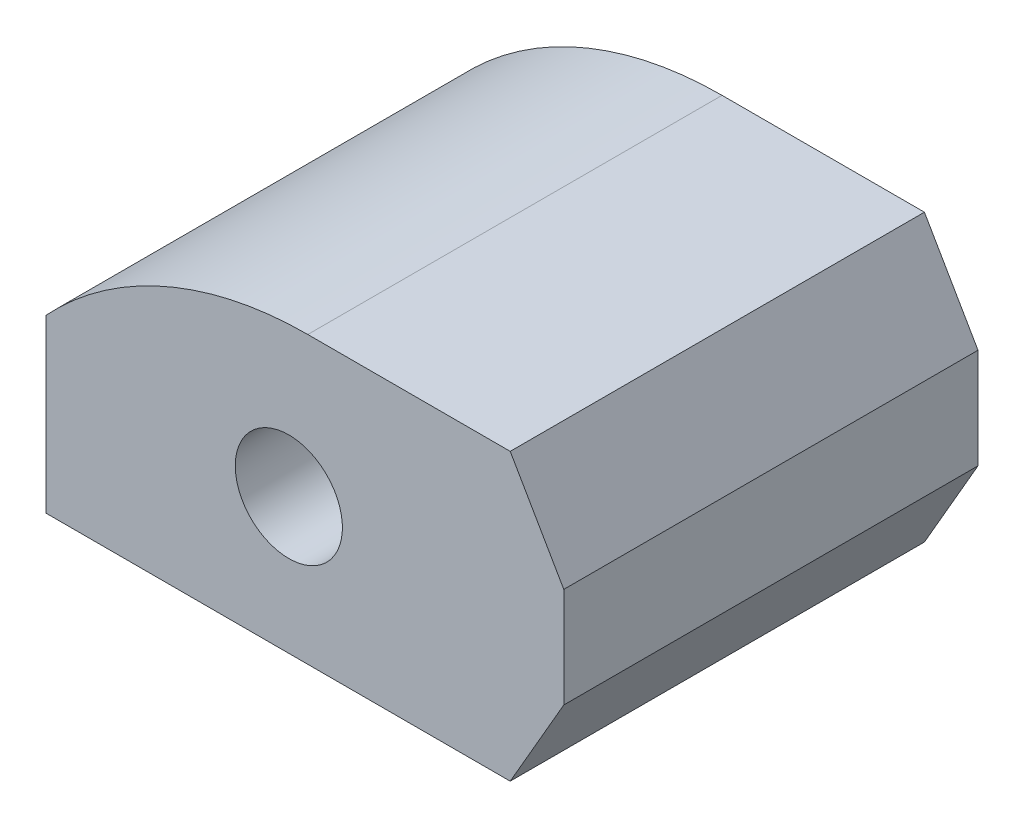
ISO-10303-21;
HEADER;
FILE_DESCRIPTION(('STEP AP214'),'2;1');
FILE_NAME('part.step','',(''),(''),'','','');
FILE_SCHEMA(('AUTOMOTIVE_DESIGN { 1 0 10303 214 1 1 1 1 }'));
ENDSEC;
DATA;
#1=APPLICATION_CONTEXT('core data for automotive mechanical design processes');
#2=APPLICATION_PROTOCOL_DEFINITION('international standard','automotive_design',2000,#1);
#3=PRODUCT_CONTEXT('',#1,'mechanical');
#4=PRODUCT('Part','Part','',(#3));
#5=PRODUCT_RELATED_PRODUCT_CATEGORY('part','',(#4));
#6=PRODUCT_DEFINITION_FORMATION('','',#4);
#7=PRODUCT_DEFINITION_CONTEXT('part definition',#1,'design');
#8=PRODUCT_DEFINITION('design','',#6,#7);
#9=PRODUCT_DEFINITION_SHAPE('','',#8);
#10=(LENGTH_UNIT() NAMED_UNIT(*) SI_UNIT(.MILLI.,.METRE.));
#11=(NAMED_UNIT(*) PLANE_ANGLE_UNIT() SI_UNIT($,.RADIAN.));
#12=(NAMED_UNIT(*) SI_UNIT($,.STERADIAN.) SOLID_ANGLE_UNIT());
#13=UNCERTAINTY_MEASURE_WITH_UNIT(LENGTH_MEASURE(1.E-05),#10,'distance_accuracy_value','');
#14=(GEOMETRIC_REPRESENTATION_CONTEXT(3) GLOBAL_UNCERTAINTY_ASSIGNED_CONTEXT((#13)) GLOBAL_UNIT_ASSIGNED_CONTEXT((#10,
#11,#12)) REPRESENTATION_CONTEXT('',''));
#15=CARTESIAN_POINT('',(0.,0.,0.));
#16=DIRECTION('',(0.,0.,1.));
#17=DIRECTION('',(1.,0.,0.));
#18=AXIS2_PLACEMENT_3D('',#15,#16,#17);
#19=CARTESIAN_POINT('',(2.66060555964671,-29.,58.));
#20=DIRECTION('',(0.,0.,-1.));
#21=DIRECTION('',(-1.,0.,0.));
#22=AXIS2_PLACEMENT_3D('',#19,#20,#21);
#23=PLANE('',#22);
#24=CARTESIAN_POINT('',(2.66060555964671,-29.,58.));
#25=DIRECTION('',(0.,0.,1.));
#26=DIRECTION('',(-1.,0.,0.));
#27=AXIS2_PLACEMENT_3D('',#24,#25,#26);
#28=CIRCLE('',#27,50.);
#29=CARTESIAN_POINT('',(2.6606055596467,21.,58.));
#30=VERTEX_POINT('',#29);
#31=CARTESIAN_POINT('',(-34.,5.,58.));
#32=VERTEX_POINT('',#31);
#33=EDGE_CURVE('E145',#30,#32,#28,.T.);
#34=ORIENTED_EDGE('',*,*,#33,.T.);
#35=DIRECTION('',(0.,-1.,0.));
#36=VECTOR('',#35,1.);
#37=CARTESIAN_POINT('',(-34.,5.,58.));
#38=LINE('',#37,#36);
#39=CARTESIAN_POINT('',(-34.,-19.,58.));
#40=VERTEX_POINT('',#39);
#41=EDGE_CURVE('E98',#32,#40,#38,.T.);
#42=ORIENTED_EDGE('',*,*,#41,.T.);
#43=DIRECTION('',(1.,0.,0.));
#44=VECTOR('',#43,1.);
#45=CARTESIAN_POINT('',(-34.,-19.,58.));
#46=LINE('',#45,#44);
#47=CARTESIAN_POINT('',(31.,-19.,58.));
#48=VERTEX_POINT('',#47);
#49=EDGE_CURVE('E157',#40,#48,#46,.T.);
#50=ORIENTED_EDGE('',*,*,#49,.T.);
#51=DIRECTION('',(0.500000000000001,0.866025403784438,0.));
#52=VECTOR('',#51,1.);
#53=CARTESIAN_POINT('',(31.,-19.,58.));
#54=LINE('',#53,#52);
#55=CARTESIAN_POINT('',(38.5,-6.00961894323343,58.));
#56=VERTEX_POINT('',#55);
#57=EDGE_CURVE('E114',#48,#56,#54,.T.);
#58=ORIENTED_EDGE('',*,*,#57,.T.);
#59=DIRECTION('',(0.,1.,0.));
#60=VECTOR('',#59,1.);
#61=CARTESIAN_POINT('',(38.5,-6.00961894323343,58.));
#62=LINE('',#61,#60);
#63=CARTESIAN_POINT('',(38.5,8.00961894323341,58.));
#64=VERTEX_POINT('',#63);
#65=EDGE_CURVE('E108',#56,#64,#62,.T.);
#66=ORIENTED_EDGE('',*,*,#65,.T.);
#67=DIRECTION('',(-0.500000000000004,0.866025403784437,0.));
#68=VECTOR('',#67,1.);
#69=CARTESIAN_POINT('',(38.5,8.00961894323341,58.));
#70=LINE('',#69,#68);
#71=CARTESIAN_POINT('',(30.9999999999999,21.,58.));
#72=VERTEX_POINT('',#71);
#73=EDGE_CURVE('E112',#64,#72,#70,.T.);
#74=ORIENTED_EDGE('',*,*,#73,.T.);
#75=DIRECTION('',(-1.,0.,0.));
#76=VECTOR('',#75,1.);
#77=CARTESIAN_POINT('',(30.9999999999999,21.,58.));
#78=LINE('',#77,#76);
#79=EDGE_CURVE('E58',#72,#30,#78,.T.);
#80=ORIENTED_EDGE('',*,*,#79,.T.);
#81=EDGE_LOOP('',(#34,#42,#50,#58,#66,#74,#80));
#82=FACE_BOUND('',#81,.T.);
#83=CARTESIAN_POINT('',(0.,0.,58.));
#84=DIRECTION('',(0.,0.,1.));
#85=DIRECTION('',(1.,0.,0.));
#86=AXIS2_PLACEMENT_3D('',#83,#84,#85);
#87=CIRCLE('',#86,7.5);
#88=CARTESIAN_POINT('',(-7.5,0.,58.));
#89=VERTEX_POINT('',#88);
#90=EDGE_CURVE('E136',#89,#89,#87,.T.);
#91=ORIENTED_EDGE('',*,*,#90,.F.);
#92=EDGE_LOOP('',(#91));
#93=FACE_BOUND('',#92,.T.);
#94=ADVANCED_FACE('F41',(#82,#93),#23,.F.);
#95=CARTESIAN_POINT('',(2.66060555964671,-29.,0.));
#96=DIRECTION('',(0.,0.,-1.));
#97=DIRECTION('',(-1.,0.,0.));
#98=AXIS2_PLACEMENT_3D('',#95,#96,#97);
#99=PLANE('',#98);
#100=CARTESIAN_POINT('',(2.66060555964671,-29.,0.));
#101=DIRECTION('',(0.,0.,1.));
#102=DIRECTION('',(-1.,0.,0.));
#103=AXIS2_PLACEMENT_3D('',#100,#101,#102);
#104=CIRCLE('',#103,50.);
#105=CARTESIAN_POINT('',(2.6606055596467,21.,0.));
#106=VERTEX_POINT('',#105);
#107=CARTESIAN_POINT('',(-34.,5.,0.));
#108=VERTEX_POINT('',#107);
#109=EDGE_CURVE('E132',#106,#108,#104,.T.);
#110=ORIENTED_EDGE('',*,*,#109,.F.);
#111=DIRECTION('',(-1.,0.,0.));
#112=VECTOR('',#111,1.);
#113=CARTESIAN_POINT('',(30.9999999999999,21.,0.));
#114=LINE('',#113,#112);
#115=CARTESIAN_POINT('',(30.9999999999999,21.,0.));
#116=VERTEX_POINT('',#115);
#117=EDGE_CURVE('E90',#116,#106,#114,.T.);
#118=ORIENTED_EDGE('',*,*,#117,.F.);
#119=DIRECTION('',(-0.500000000000004,0.866025403784437,0.));
#120=VECTOR('',#119,1.);
#121=CARTESIAN_POINT('',(38.5,8.00961894323341,0.));
#122=LINE('',#121,#120);
#123=CARTESIAN_POINT('',(38.5,8.00961894323341,0.));
#124=VERTEX_POINT('',#123);
#125=EDGE_CURVE('E84',#124,#116,#122,.T.);
#126=ORIENTED_EDGE('',*,*,#125,.F.);
#127=DIRECTION('',(0.,1.,0.));
#128=VECTOR('',#127,1.);
#129=CARTESIAN_POINT('',(38.5,-6.00961894323343,0.));
#130=LINE('',#129,#128);
#131=CARTESIAN_POINT('',(38.5,-6.00961894323343,0.));
#132=VERTEX_POINT('',#131);
#133=EDGE_CURVE('E122',#132,#124,#130,.T.);
#134=ORIENTED_EDGE('',*,*,#133,.F.);
#135=DIRECTION('',(0.500000000000001,0.866025403784438,0.));
#136=VECTOR('',#135,1.);
#137=CARTESIAN_POINT('',(31.,-19.,0.));
#138=LINE('',#137,#136);
#139=CARTESIAN_POINT('',(31.,-19.,0.));
#140=VERTEX_POINT('',#139);
#141=EDGE_CURVE('E140',#140,#132,#138,.T.);
#142=ORIENTED_EDGE('',*,*,#141,.F.);
#143=DIRECTION('',(1.,0.,0.));
#144=VECTOR('',#143,1.);
#145=CARTESIAN_POINT('',(-34.,-19.,0.));
#146=LINE('',#145,#144);
#147=CARTESIAN_POINT('',(-34.,-19.,0.));
#148=VERTEX_POINT('',#147);
#149=EDGE_CURVE('E138',#148,#140,#146,.T.);
#150=ORIENTED_EDGE('',*,*,#149,.F.);
#151=DIRECTION('',(0.,-1.,0.));
#152=VECTOR('',#151,1.);
#153=CARTESIAN_POINT('',(-34.,5.,0.));
#154=LINE('',#153,#152);
#155=EDGE_CURVE('E135',#108,#148,#154,.T.);
#156=ORIENTED_EDGE('',*,*,#155,.F.);
#157=EDGE_LOOP('',(#110,#118,#126,#134,#142,#150,#156));
#158=FACE_BOUND('',#157,.T.);
#159=CARTESIAN_POINT('',(0.,0.,0.));
#160=DIRECTION('',(0.,0.,1.));
#161=DIRECTION('',(1.,0.,0.));
#162=AXIS2_PLACEMENT_3D('',#159,#160,#161);
#163=CIRCLE('',#162,7.5);
#164=CARTESIAN_POINT('',(-7.5,0.,0.));
#165=VERTEX_POINT('',#164);
#166=EDGE_CURVE('E169',#165,#165,#163,.T.);
#167=ORIENTED_EDGE('',*,*,#166,.T.);
#168=EDGE_LOOP('',(#167));
#169=FACE_BOUND('',#168,.T.);
#170=ADVANCED_FACE('F161',(#158,#169),#99,.T.);
#171=CARTESIAN_POINT('',(2.66060555964671,-29.,58.));
#172=DIRECTION('',(0.,0.,-1.));
#173=DIRECTION('',(-1.,0.,0.));
#174=AXIS2_PLACEMENT_3D('',#171,#172,#173);
#175=CYLINDRICAL_SURFACE('',#174,50.);
#176=ORIENTED_EDGE('',*,*,#109,.T.);
#177=DIRECTION('',(0.,0.,-1.));
#178=VECTOR('',#177,1.);
#179=CARTESIAN_POINT('',(-34.,5.,58.));
#180=LINE('',#179,#178);
#181=EDGE_CURVE('E11',#32,#108,#180,.T.);
#182=ORIENTED_EDGE('',*,*,#181,.F.);
#183=ORIENTED_EDGE('',*,*,#33,.F.);
#184=DIRECTION('',(0.,0.,-1.));
#185=VECTOR('',#184,1.);
#186=CARTESIAN_POINT('',(2.6606055596467,21.,58.));
#187=LINE('',#186,#185);
#188=EDGE_CURVE('E128',#30,#106,#187,.T.);
#189=ORIENTED_EDGE('',*,*,#188,.T.);
#190=EDGE_LOOP('',(#176,#182,#183,#189));
#191=FACE_BOUND('',#190,.T.);
#192=ADVANCED_FACE('F43',(#191),#175,.T.);
#193=CARTESIAN_POINT('',(-34.,5.,58.));
#194=DIRECTION('',(1.,0.,0.));
#195=DIRECTION('',(0.,1.,0.));
#196=AXIS2_PLACEMENT_3D('',#193,#194,#195);
#197=PLANE('',#196);
#198=ORIENTED_EDGE('',*,*,#155,.T.);
#199=DIRECTION('',(0.,0.,-1.));
#200=VECTOR('',#199,1.);
#201=CARTESIAN_POINT('',(-34.,-19.,58.));
#202=LINE('',#201,#200);
#203=EDGE_CURVE('E50',#40,#148,#202,.T.);
#204=ORIENTED_EDGE('',*,*,#203,.F.);
#205=ORIENTED_EDGE('',*,*,#41,.F.);
#206=ORIENTED_EDGE('',*,*,#181,.T.);
#207=EDGE_LOOP('',(#198,#204,#205,#206));
#208=FACE_BOUND('',#207,.T.);
#209=ADVANCED_FACE('F195',(#208),#197,.F.);
#210=CARTESIAN_POINT('',(-34.,-19.,58.));
#211=DIRECTION('',(0.,1.,0.));
#212=DIRECTION('',(-1.,0.,0.));
#213=AXIS2_PLACEMENT_3D('',#210,#211,#212);
#214=PLANE('',#213);
#215=ORIENTED_EDGE('',*,*,#149,.T.);
#216=DIRECTION('',(0.,0.,-1.));
#217=VECTOR('',#216,1.);
#218=CARTESIAN_POINT('',(31.,-19.,58.));
#219=LINE('',#218,#217);
#220=EDGE_CURVE('E149',#48,#140,#219,.T.);
#221=ORIENTED_EDGE('',*,*,#220,.F.);
#222=ORIENTED_EDGE('',*,*,#49,.F.);
#223=ORIENTED_EDGE('',*,*,#203,.T.);
#224=EDGE_LOOP('',(#215,#221,#222,#223));
#225=FACE_BOUND('',#224,.T.);
#226=ADVANCED_FACE('F155',(#225),#214,.F.);
#227=CARTESIAN_POINT('',(31.,-19.,58.));
#228=DIRECTION('',(-0.866025403784438,0.500000000000001,0.));
#229=DIRECTION('',(-0.500000000000001,-0.866025403784438,0.));
#230=AXIS2_PLACEMENT_3D('',#227,#228,#229);
#231=PLANE('',#230);
#232=ORIENTED_EDGE('',*,*,#141,.T.);
#233=DIRECTION('',(0.,0.,-1.));
#234=VECTOR('',#233,1.);
#235=CARTESIAN_POINT('',(38.5,-6.00961894323343,58.));
#236=LINE('',#235,#234);
#237=EDGE_CURVE('E123',#56,#132,#236,.T.);
#238=ORIENTED_EDGE('',*,*,#237,.F.);
#239=ORIENTED_EDGE('',*,*,#57,.F.);
#240=ORIENTED_EDGE('',*,*,#220,.T.);
#241=EDGE_LOOP('',(#232,#238,#239,#240));
#242=FACE_BOUND('',#241,.T.);
#243=ADVANCED_FACE('F164',(#242),#231,.F.);
#244=CARTESIAN_POINT('',(38.5,-6.00961894323343,58.));
#245=DIRECTION('',(-1.,0.,0.));
#246=DIRECTION('',(0.,-1.,0.));
#247=AXIS2_PLACEMENT_3D('',#244,#245,#246);
#248=PLANE('',#247);
#249=ORIENTED_EDGE('',*,*,#133,.T.);
#250=DIRECTION('',(0.,0.,-1.));
#251=VECTOR('',#250,1.);
#252=CARTESIAN_POINT('',(38.5,8.00961894323341,58.));
#253=LINE('',#252,#251);
#254=EDGE_CURVE('E119',#64,#124,#253,.T.);
#255=ORIENTED_EDGE('',*,*,#254,.F.);
#256=ORIENTED_EDGE('',*,*,#65,.F.);
#257=ORIENTED_EDGE('',*,*,#237,.T.);
#258=EDGE_LOOP('',(#249,#255,#256,#257));
#259=FACE_BOUND('',#258,.T.);
#260=ADVANCED_FACE('F120',(#259),#248,.F.);
#261=CARTESIAN_POINT('',(38.5,8.00961894323341,58.));
#262=DIRECTION('',(-0.866025403784436,-0.500000000000004,0.));
#263=DIRECTION('',(0.500000000000004,-0.866025403784436,0.));
#264=AXIS2_PLACEMENT_3D('',#261,#262,#263);
#265=PLANE('',#264);
#266=ORIENTED_EDGE('',*,*,#125,.T.);
#267=DIRECTION('',(0.,0.,-1.));
#268=VECTOR('',#267,1.);
#269=CARTESIAN_POINT('',(30.9999999999999,21.,58.));
#270=LINE('',#269,#268);
#271=EDGE_CURVE('E124',#72,#116,#270,.T.);
#272=ORIENTED_EDGE('',*,*,#271,.F.);
#273=ORIENTED_EDGE('',*,*,#73,.F.);
#274=ORIENTED_EDGE('',*,*,#254,.T.);
#275=EDGE_LOOP('',(#266,#272,#273,#274));
#276=FACE_BOUND('',#275,.T.);
#277=ADVANCED_FACE('F126',(#276),#265,.F.);
#278=CARTESIAN_POINT('',(30.9999999999999,21.,58.));
#279=DIRECTION('',(0.,-1.,0.));
#280=DIRECTION('',(1.,0.,0.));
#281=AXIS2_PLACEMENT_3D('',#278,#279,#280);
#282=PLANE('',#281);
#283=ORIENTED_EDGE('',*,*,#117,.T.);
#284=ORIENTED_EDGE('',*,*,#188,.F.);
#285=ORIENTED_EDGE('',*,*,#79,.F.);
#286=ORIENTED_EDGE('',*,*,#271,.T.);
#287=EDGE_LOOP('',(#283,#284,#285,#286));
#288=FACE_BOUND('',#287,.T.);
#289=ADVANCED_FACE('F185',(#288),#282,.F.);
#290=CARTESIAN_POINT('',(0.,0.,58.));
#291=DIRECTION('',(0.,0.,-1.));
#292=DIRECTION('',(-1.,0.,0.));
#293=AXIS2_PLACEMENT_3D('',#290,#291,#292);
#294=CYLINDRICAL_SURFACE('',#293,7.5);
#295=CARTESIAN_POINT('',(-7.5,0.,58.));
#296=CARTESIAN_POINT('',(-7.5,0.,57.3958333333333));
#297=CARTESIAN_POINT('',(-7.5,0.,56.7916666666667));
#298=CARTESIAN_POINT('',(-7.5,0.,55.5833333333333));
#299=CARTESIAN_POINT('',(-7.5,0.,54.9791666666667));
#300=CARTESIAN_POINT('',(-7.5,0.,53.7708333333333));
#301=CARTESIAN_POINT('',(-7.5,0.,53.1666666666667));
#302=CARTESIAN_POINT('',(-7.5,0.,51.9583333333333));
#303=CARTESIAN_POINT('',(-7.5,0.,51.3541666666667));
#304=CARTESIAN_POINT('',(-7.5,0.,50.1458333333333));
#305=CARTESIAN_POINT('',(-7.5,0.,49.5416666666667));
#306=CARTESIAN_POINT('',(-7.5,0.,48.3333333333333));
#307=CARTESIAN_POINT('',(-7.5,0.,47.7291666666667));
#308=CARTESIAN_POINT('',(-7.5,0.,46.5208333333333));
#309=CARTESIAN_POINT('',(-7.5,0.,45.9166666666667));
#310=CARTESIAN_POINT('',(-7.5,0.,44.7083333333333));
#311=CARTESIAN_POINT('',(-7.5,0.,44.1041666666667));
#312=CARTESIAN_POINT('',(-7.5,0.,42.8958333333333));
#313=CARTESIAN_POINT('',(-7.5,0.,42.2916666666667));
#314=CARTESIAN_POINT('',(-7.5,0.,41.0833333333333));
#315=CARTESIAN_POINT('',(-7.5,0.,40.4791666666667));
#316=CARTESIAN_POINT('',(-7.5,0.,39.2708333333333));
#317=CARTESIAN_POINT('',(-7.5,0.,38.6666666666667));
#318=CARTESIAN_POINT('',(-7.5,0.,37.4583333333333));
#319=CARTESIAN_POINT('',(-7.5,0.,36.8541666666667));
#320=CARTESIAN_POINT('',(-7.5,0.,35.6458333333333));
#321=CARTESIAN_POINT('',(-7.5,0.,35.0416666666667));
#322=CARTESIAN_POINT('',(-7.5,0.,33.8333333333333));
#323=CARTESIAN_POINT('',(-7.5,0.,33.2291666666667));
#324=CARTESIAN_POINT('',(-7.5,0.,32.0208333333333));
#325=CARTESIAN_POINT('',(-7.5,0.,31.4166666666667));
#326=CARTESIAN_POINT('',(-7.5,0.,30.2083333333333));
#327=CARTESIAN_POINT('',(-7.5,0.,29.6041666666667));
#328=CARTESIAN_POINT('',(-7.5,0.,28.3958333333333));
#329=CARTESIAN_POINT('',(-7.5,0.,27.7916666666667));
#330=CARTESIAN_POINT('',(-7.5,0.,26.5833333333333));
#331=CARTESIAN_POINT('',(-7.5,0.,25.9791666666667));
#332=CARTESIAN_POINT('',(-7.5,0.,24.7708333333333));
#333=CARTESIAN_POINT('',(-7.5,0.,24.1666666666667));
#334=CARTESIAN_POINT('',(-7.5,0.,22.9583333333333));
#335=CARTESIAN_POINT('',(-7.5,0.,22.3541666666667));
#336=CARTESIAN_POINT('',(-7.5,0.,21.1458333333333));
#337=CARTESIAN_POINT('',(-7.5,0.,20.5416666666667));
#338=CARTESIAN_POINT('',(-7.5,0.,19.3333333333333));
#339=CARTESIAN_POINT('',(-7.5,0.,18.7291666666667));
#340=CARTESIAN_POINT('',(-7.5,0.,17.5208333333333));
#341=CARTESIAN_POINT('',(-7.5,0.,16.9166666666667));
#342=CARTESIAN_POINT('',(-7.5,0.,15.7083333333333));
#343=CARTESIAN_POINT('',(-7.5,0.,15.1041666666667));
#344=CARTESIAN_POINT('',(-7.5,0.,13.8958333333333));
#345=CARTESIAN_POINT('',(-7.5,0.,13.2916666666667));
#346=CARTESIAN_POINT('',(-7.5,0.,12.0833333333333));
#347=CARTESIAN_POINT('',(-7.5,0.,11.4791666666667));
#348=CARTESIAN_POINT('',(-7.5,0.,10.2708333333333));
#349=CARTESIAN_POINT('',(-7.5,0.,9.66666666666667));
#350=CARTESIAN_POINT('',(-7.5,0.,8.45833333333333));
#351=CARTESIAN_POINT('',(-7.5,0.,7.85416666666667));
#352=CARTESIAN_POINT('',(-7.5,0.,6.64583333333333));
#353=CARTESIAN_POINT('',(-7.5,0.,6.04166666666667));
#354=CARTESIAN_POINT('',(-7.5,0.,4.83333333333333));
#355=CARTESIAN_POINT('',(-7.5,0.,4.22916666666667));
#356=CARTESIAN_POINT('',(-7.5,0.,3.02083333333334));
#357=CARTESIAN_POINT('',(-7.5,0.,2.41666666666667));
#358=CARTESIAN_POINT('',(-7.5,0.,1.20833333333333));
#359=CARTESIAN_POINT('',(-7.5,0.,0.604166666666666));
#360=CARTESIAN_POINT('',(-7.5,0.,0.));
#361=B_SPLINE_CURVE_WITH_KNOTS('',3,(#295,#296,#297,#298,#299,#300,#301,#302,#303,#304,#305,
#306,#307,#308,#309,#310,#311,#312,#313,#314,#315,#316,#317,#318,#319,#320,#321,#322,#323,#324,
#325,#326,#327,#328,#329,#330,#331,#332,#333,#334,#335,#336,#337,#338,#339,#340,#341,#342,#343,
#344,#345,#346,#347,#348,#349,#350,#351,#352,#353,#354,#355,#356,#357,#358,#359,#360),
.UNSPECIFIED.,.F.,.F.,(4,2,2,2,2,2,2,2,2,2,2,2,2,2,2,2,2,2,2,2,2,2,2,2,2,2,2,2,2,2,2,2,4),(0.,
1.8125,3.625,5.4375,7.25000000000001,9.0625,10.875,12.6875,14.5,16.3125,18.125,19.9375,21.75,
23.5625,25.375,27.1875,29.,30.8125,32.625,34.4375,36.25,38.0625,39.875,41.6875,43.5,45.3125,
47.125,48.9375,50.75,52.5625,54.375,56.1875,58.),.UNSPECIFIED.);
#362=EDGE_CURVE('BSEAM175',#89,#165,#361,.T.);
#363=ORIENTED_EDGE('',*,*,#90,.T.);
#364=ORIENTED_EDGE('',*,*,#166,.F.);
#365=ORIENTED_EDGE('',*,*,#362,.T.);
#366=ORIENTED_EDGE('',*,*,#362,.F.);
#367=EDGE_LOOP('',(#363,#365,#364,#366));
#368=FACE_BOUND('',#367,.T.);
#369=ADVANCED_FACE('F175',(#368),#294,.F.);
#370=CLOSED_SHELL('',(#94,#170,#192,#209,#226,#243,#260,#277,#289,#369));
#371=MANIFOLD_SOLID_BREP('B2',#370);
#372=ADVANCED_BREP_SHAPE_REPRESENTATION('',(#18,#371),#14);
#373=SHAPE_DEFINITION_REPRESENTATION(#9,#372);
ENDSEC;
END-ISO-10303-21;
